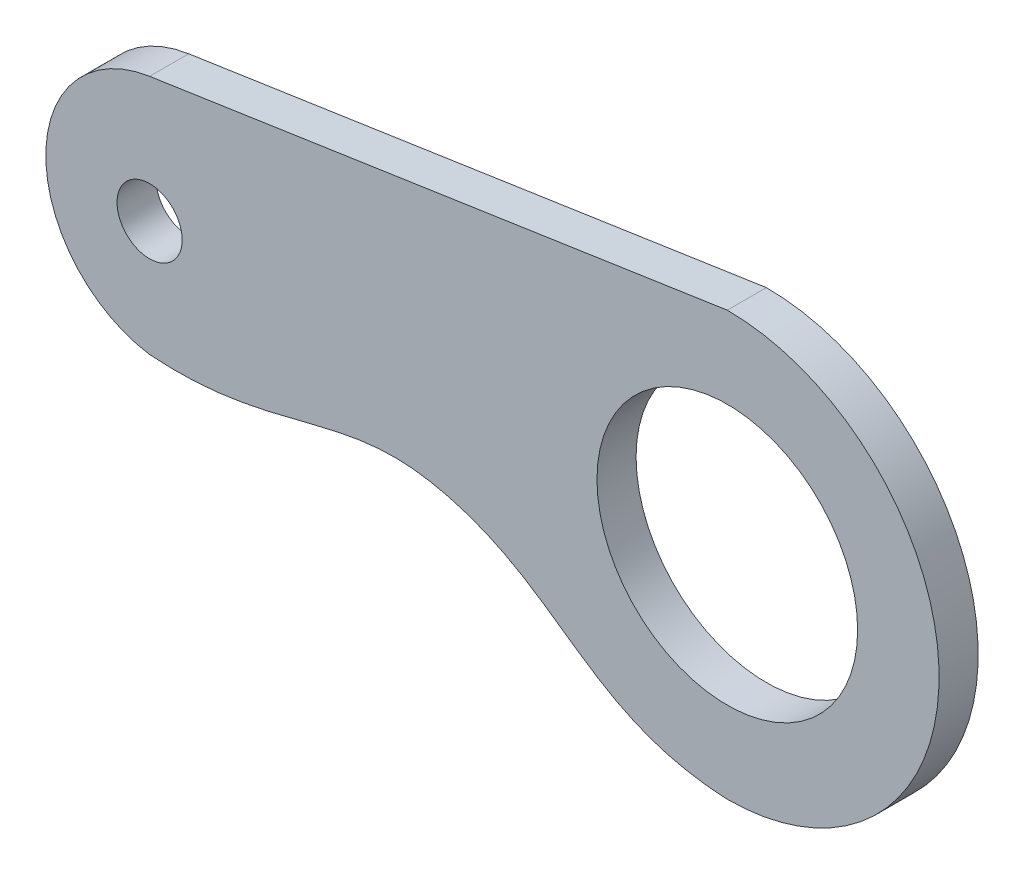
ISO-10303-21;
HEADER;
FILE_DESCRIPTION(('STEP AP214'),'2;1');
FILE_NAME('part.step','',(''),(''),'','','');
FILE_SCHEMA(('AUTOMOTIVE_DESIGN { 1 0 10303 214 1 1 1 1 }'));
ENDSEC;
DATA;
#1=APPLICATION_CONTEXT('core data for automotive mechanical design processes');
#2=APPLICATION_PROTOCOL_DEFINITION('international standard','automotive_design',2000,#1);
#3=PRODUCT_CONTEXT('',#1,'mechanical');
#4=PRODUCT('Part','Part','',(#3));
#5=PRODUCT_RELATED_PRODUCT_CATEGORY('part','',(#4));
#6=PRODUCT_DEFINITION_FORMATION('','',#4);
#7=PRODUCT_DEFINITION_CONTEXT('part definition',#1,'design');
#8=PRODUCT_DEFINITION('design','',#6,#7);
#9=PRODUCT_DEFINITION_SHAPE('','',#8);
#10=(LENGTH_UNIT() NAMED_UNIT(*) SI_UNIT(.MILLI.,.METRE.));
#11=(NAMED_UNIT(*) PLANE_ANGLE_UNIT() SI_UNIT($,.RADIAN.));
#12=(NAMED_UNIT(*) SI_UNIT($,.STERADIAN.) SOLID_ANGLE_UNIT());
#13=UNCERTAINTY_MEASURE_WITH_UNIT(LENGTH_MEASURE(1.E-05),#10,'distance_accuracy_value','');
#14=(GEOMETRIC_REPRESENTATION_CONTEXT(3) GLOBAL_UNCERTAINTY_ASSIGNED_CONTEXT((#13)) GLOBAL_UNIT_ASSIGNED_CONTEXT((#10,
#11,#12)) REPRESENTATION_CONTEXT('',''));
#15=CARTESIAN_POINT('',(0.,0.,0.));
#16=DIRECTION('',(0.,0.,1.));
#17=DIRECTION('',(1.,0.,0.));
#18=AXIS2_PLACEMENT_3D('',#15,#16,#17);
#19=CARTESIAN_POINT('',(-85.8895063787426,0.761464885067403,6.));
#20=DIRECTION('',(0.,0.,1.));
#21=DIRECTION('',(1.,0.,0.));
#22=AXIS2_PLACEMENT_3D('',#19,#20,#21);
#23=PLANE('',#22);
#24=CARTESIAN_POINT('',(0.,0.,6.));
#25=DIRECTION('',(0.,0.,1.));
#26=DIRECTION('',(1.,0.,0.));
#27=AXIS2_PLACEMENT_3D('',#24,#25,#26);
#28=CIRCLE('',#27,20.);
#29=CARTESIAN_POINT('',(20.,0.,6.));
#30=VERTEX_POINT('',#29);
#31=EDGE_CURVE('E102',#30,#30,#28,.T.);
#32=ORIENTED_EDGE('',*,*,#31,.F.);
#33=EDGE_LOOP('',(#32));
#34=FACE_BOUND('',#33,.T.);
#35=CARTESIAN_POINT('',(-85.8895063787426,0.761464885067403,6.));
#36=DIRECTION('',(0.,0.,1.));
#37=DIRECTION('',(1.,0.,0.));
#38=AXIS2_PLACEMENT_3D('',#35,#36,#37);
#39=CIRCLE('',#38,18.692942342529);
#40=CARTESIAN_POINT('',(-88.6528487708673,19.2490291444554,6.));
#41=VERTEX_POINT('',#40);
#42=CARTESIAN_POINT('',(-88.6528487708673,-17.7260993743206,6.));
#43=VERTEX_POINT('',#42);
#44=EDGE_CURVE('E84',#41,#43,#39,.T.);
#45=ORIENTED_EDGE('',*,*,#44,.T.);
#46=CARTESIAN_POINT('',(-88.6528487708673,-17.7260993743206,6.));
#47=CARTESIAN_POINT('',(-70.9126570136436,-19.0484713673654,6.));
#48=CARTESIAN_POINT('',(-58.6690566242389,-9.57526338576216,6.));
#49=CARTESIAN_POINT('',(-25.5131976148036,-17.9469643858664,6.));
#50=CARTESIAN_POINT('',(-19.3852329238656,-31.6234384685904,6.));
#51=CARTESIAN_POINT('',(5.72423913671934E-13,-32.5,6.));
#52=B_SPLINE_CURVE_WITH_KNOTS('',3,(#46,#47,#48,#49,#50,#51),.UNSPECIFIED.,.F.,.F.,(4,1,1,4),
(0.,0.41217496192607,0.512174961926069,1.),.UNSPECIFIED.);
#53=CARTESIAN_POINT('',(0.,-32.4999999999999,6.));
#54=VERTEX_POINT('',#53);
#55=EDGE_CURVE('E79',#43,#54,#52,.T.);
#56=ORIENTED_EDGE('',*,*,#55,.T.);
#57=CARTESIAN_POINT('',(0.,0.,6.));
#58=DIRECTION('',(0.,0.,1.));
#59=DIRECTION('',(1.,0.,0.));
#60=AXIS2_PLACEMENT_3D('',#57,#58,#59);
#61=CIRCLE('',#60,32.4999999999999);
#62=CARTESIAN_POINT('',(0.,32.4999999999999,6.));
#63=VERTEX_POINT('',#62);
#64=EDGE_CURVE('E82',#54,#63,#61,.T.);
#65=ORIENTED_EDGE('',*,*,#64,.T.);
#66=DIRECTION('',(-0.989013068174198,-0.147828112957782,0.));
#67=VECTOR('',#66,1.);
#68=CARTESIAN_POINT('',(-88.6528487708673,19.2490291444554,6.));
#69=LINE('',#68,#67);
#70=EDGE_CURVE('E49',#63,#41,#69,.T.);
#71=ORIENTED_EDGE('',*,*,#70,.T.);
#72=EDGE_LOOP('',(#45,#56,#65,#71));
#73=FACE_BOUND('',#72,.T.);
#74=CARTESIAN_POINT('',(-88.6528487708673,0.,6.));
#75=DIRECTION('',(0.,0.,1.));
#76=DIRECTION('',(1.,0.,0.));
#77=AXIS2_PLACEMENT_3D('',#74,#75,#76);
#78=CIRCLE('',#77,4.99999999998671);
#79=CARTESIAN_POINT('',(-83.6528487708805,0.,6.));
#80=VERTEX_POINT('',#79);
#81=EDGE_CURVE('E122',#80,#80,#78,.T.);
#82=ORIENTED_EDGE('',*,*,#81,.F.);
#83=EDGE_LOOP('',(#82));
#84=FACE_BOUND('',#83,.T.);
#85=ADVANCED_FACE('F32',(#34,#73,#84),#23,.T.);
#86=CARTESIAN_POINT('',(-85.8895063787426,0.761464885067403,0.));
#87=DIRECTION('',(0.,0.,1.));
#88=DIRECTION('',(1.,0.,0.));
#89=AXIS2_PLACEMENT_3D('',#86,#87,#88);
#90=PLANE('',#89);
#91=CARTESIAN_POINT('',(0.,0.,0.));
#92=DIRECTION('',(0.,0.,1.));
#93=DIRECTION('',(1.,0.,0.));
#94=AXIS2_PLACEMENT_3D('',#91,#92,#93);
#95=CIRCLE('',#94,20.);
#96=CARTESIAN_POINT('',(20.,0.,0.));
#97=VERTEX_POINT('',#96);
#98=EDGE_CURVE('E119',#97,#97,#95,.T.);
#99=ORIENTED_EDGE('',*,*,#98,.T.);
#100=EDGE_LOOP('',(#99));
#101=FACE_BOUND('',#100,.T.);
#102=CARTESIAN_POINT('',(-85.8895063787426,0.761464885067403,0.));
#103=DIRECTION('',(0.,0.,1.));
#104=DIRECTION('',(1.,0.,0.));
#105=AXIS2_PLACEMENT_3D('',#102,#103,#104);
#106=CIRCLE('',#105,18.692942342529);
#107=CARTESIAN_POINT('',(-88.6528487708673,19.2490291444554,0.));
#108=VERTEX_POINT('',#107);
#109=CARTESIAN_POINT('',(-88.6528487708673,-17.7260993743206,0.));
#110=VERTEX_POINT('',#109);
#111=EDGE_CURVE('E99',#108,#110,#106,.T.);
#112=ORIENTED_EDGE('',*,*,#111,.F.);
#113=DIRECTION('',(-0.989013068174198,-0.147828112957782,0.));
#114=VECTOR('',#113,1.);
#115=CARTESIAN_POINT('',(-88.6528487708673,19.2490291444554,0.));
#116=LINE('',#115,#114);
#117=CARTESIAN_POINT('',(0.,32.4999999999999,0.));
#118=VERTEX_POINT('',#117);
#119=EDGE_CURVE('E72',#118,#108,#116,.T.);
#120=ORIENTED_EDGE('',*,*,#119,.F.);
#121=CARTESIAN_POINT('',(0.,0.,0.));
#122=DIRECTION('',(0.,0.,1.));
#123=DIRECTION('',(1.,0.,0.));
#124=AXIS2_PLACEMENT_3D('',#121,#122,#123);
#125=CIRCLE('',#124,32.4999999999999);
#126=CARTESIAN_POINT('',(0.,-32.4999999999999,0.));
#127=VERTEX_POINT('',#126);
#128=EDGE_CURVE('E66',#127,#118,#125,.T.);
#129=ORIENTED_EDGE('',*,*,#128,.F.);
#130=CARTESIAN_POINT('',(-88.6528487708673,-17.7260993743206,0.));
#131=CARTESIAN_POINT('',(-70.9126570136436,-19.0484713673654,0.));
#132=CARTESIAN_POINT('',(-58.6690566242389,-9.57526338576216,0.));
#133=CARTESIAN_POINT('',(-25.5131976148036,-17.9469643858664,0.));
#134=CARTESIAN_POINT('',(-19.3852329238656,-31.6234384685904,0.));
#135=CARTESIAN_POINT('',(5.72423913671934E-13,-32.5,0.));
#136=B_SPLINE_CURVE_WITH_KNOTS('',3,(#130,#131,#132,#133,#134,#135),.UNSPECIFIED.,.F.,.F.,(4,1,
1,4),(0.,0.41217496192607,0.512174961926069,1.),.UNSPECIFIED.);
#137=EDGE_CURVE('E88',#110,#127,#136,.T.);
#138=ORIENTED_EDGE('',*,*,#137,.F.);
#139=EDGE_LOOP('',(#112,#120,#129,#138));
#140=FACE_BOUND('',#139,.T.);
#141=CARTESIAN_POINT('',(-88.6528487708673,0.,0.));
#142=DIRECTION('',(0.,0.,1.));
#143=DIRECTION('',(1.,0.,0.));
#144=AXIS2_PLACEMENT_3D('',#141,#142,#143);
#145=CIRCLE('',#144,4.99999999998671);
#146=CARTESIAN_POINT('',(-83.6528487708805,0.,0.));
#147=VERTEX_POINT('',#146);
#148=EDGE_CURVE('E125',#147,#147,#145,.T.);
#149=ORIENTED_EDGE('',*,*,#148,.T.);
#150=EDGE_LOOP('',(#149));
#151=FACE_BOUND('',#150,.T.);
#152=ADVANCED_FACE('F115',(#101,#140,#151),#90,.F.);
#153=CARTESIAN_POINT('',(-85.8895063787426,0.761464885067403,6.));
#154=DIRECTION('',(0.,0.,-1.));
#155=DIRECTION('',(-1.,0.,0.));
#156=AXIS2_PLACEMENT_3D('',#153,#154,#155);
#157=CYLINDRICAL_SURFACE('',#156,18.692942342529);
#158=ORIENTED_EDGE('',*,*,#111,.T.);
#159=DIRECTION('',(0.,0.,-1.));
#160=VECTOR('',#159,1.);
#161=CARTESIAN_POINT('',(-88.6528487708673,-17.7260993743206,6.));
#162=LINE('',#161,#160);
#163=EDGE_CURVE('E11',#43,#110,#162,.T.);
#164=ORIENTED_EDGE('',*,*,#163,.F.);
#165=ORIENTED_EDGE('',*,*,#44,.F.);
#166=DIRECTION('',(0.,0.,-1.));
#167=VECTOR('',#166,1.);
#168=CARTESIAN_POINT('',(-88.6528487708673,19.2490291444554,6.));
#169=LINE('',#168,#167);
#170=EDGE_CURVE('E92',#41,#108,#169,.T.);
#171=ORIENTED_EDGE('',*,*,#170,.T.);
#172=EDGE_LOOP('',(#158,#164,#165,#171));
#173=FACE_BOUND('',#172,.T.);
#174=ADVANCED_FACE('F34',(#173),#157,.T.);
#175=DIRECTION('',(0.,0.,-1.));
#176=VECTOR('',#175,1.);
#177=SURFACE_OF_LINEAR_EXTRUSION('',#52,#176);
#178=ORIENTED_EDGE('',*,*,#137,.T.);
#179=DIRECTION('',(0.,0.,-1.));
#180=VECTOR('',#179,1.);
#181=CARTESIAN_POINT('',(0.,-32.4999999999999,6.));
#182=LINE('',#181,#180);
#183=EDGE_CURVE('E41',#54,#127,#182,.T.);
#184=ORIENTED_EDGE('',*,*,#183,.F.);
#185=ORIENTED_EDGE('',*,*,#55,.F.);
#186=ORIENTED_EDGE('',*,*,#163,.T.);
#187=EDGE_LOOP('',(#178,#184,#185,#186));
#188=FACE_BOUND('',#187,.T.);
#189=ADVANCED_FACE('F87',(#188),#177,.F.);
#190=CARTESIAN_POINT('',(0.,0.,6.));
#191=DIRECTION('',(0.,0.,-1.));
#192=DIRECTION('',(-1.,0.,0.));
#193=AXIS2_PLACEMENT_3D('',#190,#191,#192);
#194=CYLINDRICAL_SURFACE('',#193,32.4999999999999);
#195=ORIENTED_EDGE('',*,*,#128,.T.);
#196=DIRECTION('',(0.,0.,-1.));
#197=VECTOR('',#196,1.);
#198=CARTESIAN_POINT('',(0.,32.4999999999999,6.));
#199=LINE('',#198,#197);
#200=EDGE_CURVE('E89',#63,#118,#199,.T.);
#201=ORIENTED_EDGE('',*,*,#200,.F.);
#202=ORIENTED_EDGE('',*,*,#64,.F.);
#203=ORIENTED_EDGE('',*,*,#183,.T.);
#204=EDGE_LOOP('',(#195,#201,#202,#203));
#205=FACE_BOUND('',#204,.T.);
#206=ADVANCED_FACE('F90',(#205),#194,.T.);
#207=CARTESIAN_POINT('',(-88.6528487708673,19.2490291444554,6.));
#208=DIRECTION('',(0.147828112957782,-0.989013068174198,0.));
#209=DIRECTION('',(0.989013068174198,0.147828112957783,0.));
#210=AXIS2_PLACEMENT_3D('',#207,#208,#209);
#211=PLANE('',#210);
#212=ORIENTED_EDGE('',*,*,#119,.T.);
#213=ORIENTED_EDGE('',*,*,#170,.F.);
#214=ORIENTED_EDGE('',*,*,#70,.F.);
#215=ORIENTED_EDGE('',*,*,#200,.T.);
#216=EDGE_LOOP('',(#212,#213,#214,#215));
#217=FACE_BOUND('',#216,.T.);
#218=ADVANCED_FACE('F112',(#217),#211,.F.);
#219=CARTESIAN_POINT('',(0.,0.,6.));
#220=DIRECTION('',(0.,0.,-1.));
#221=DIRECTION('',(-1.,0.,0.));
#222=AXIS2_PLACEMENT_3D('',#219,#220,#221);
#223=CYLINDRICAL_SURFACE('',#222,20.);
#224=ORIENTED_EDGE('',*,*,#31,.T.);
#225=EDGE_LOOP('',(#224));
#226=FACE_BOUND('',#225,.T.);
#227=ORIENTED_EDGE('',*,*,#98,.F.);
#228=EDGE_LOOP('',(#227));
#229=FACE_BOUND('',#228,.T.);
#230=ADVANCED_FACE('F143',(#226,#229),#223,.F.);
#231=CARTESIAN_POINT('',(-88.6528487708673,0.,6.));
#232=DIRECTION('',(0.,0.,-1.));
#233=DIRECTION('',(-1.,0.,0.));
#234=AXIS2_PLACEMENT_3D('',#231,#232,#233);
#235=CYLINDRICAL_SURFACE('',#234,4.99999999998671);
#236=ORIENTED_EDGE('',*,*,#81,.T.);
#237=EDGE_LOOP('',(#236));
#238=FACE_BOUND('',#237,.T.);
#239=ORIENTED_EDGE('',*,*,#148,.F.);
#240=EDGE_LOOP('',(#239));
#241=FACE_BOUND('',#240,.T.);
#242=ADVANCED_FACE('F131',(#238,#241),#235,.F.);
#243=CLOSED_SHELL('',(#85,#152,#174,#189,#206,#218,#230,#242));
#244=MANIFOLD_SOLID_BREP('B2',#243);
#245=ADVANCED_BREP_SHAPE_REPRESENTATION('',(#18,#244),#14);
#246=SHAPE_DEFINITION_REPRESENTATION(#9,#245);
ENDSEC;
END-ISO-10303-21;
